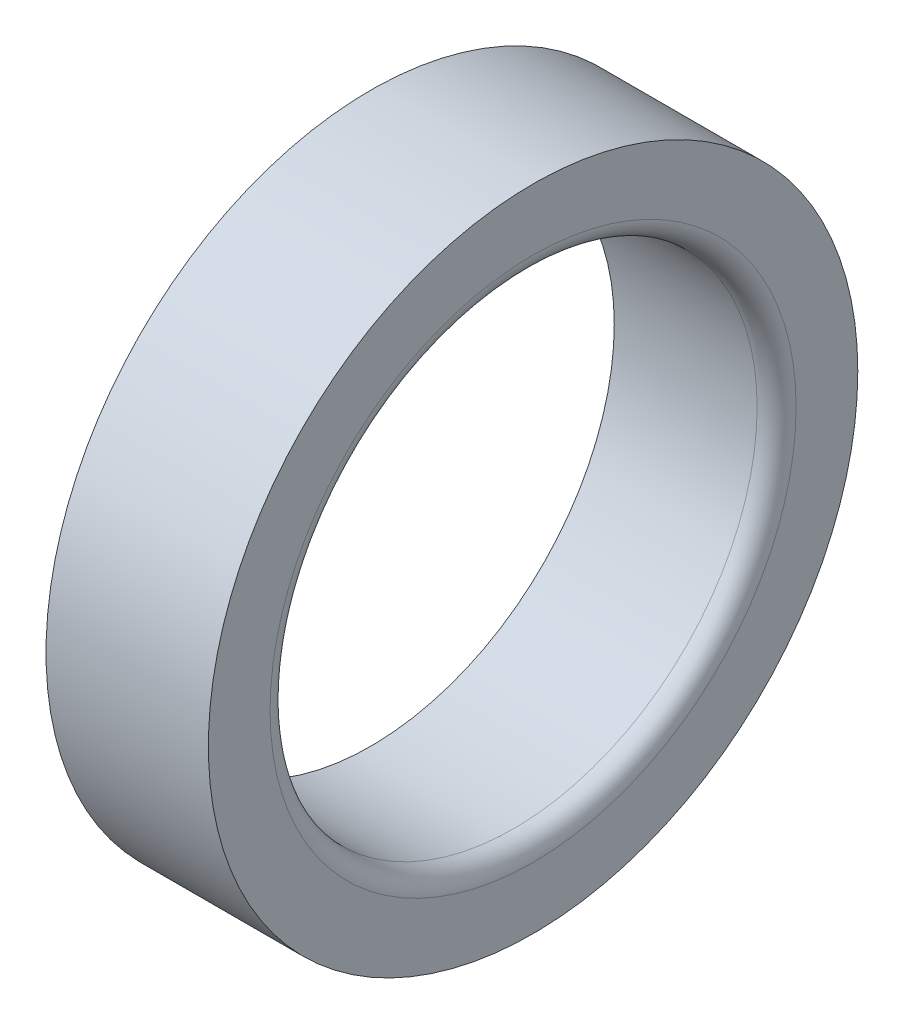
ISO-10303-21;
HEADER;
FILE_DESCRIPTION(('STEP AP214'),'2;1');
FILE_NAME('part.step','',(''),(''),'','','');
FILE_SCHEMA(('AUTOMOTIVE_DESIGN { 1 0 10303 214 1 1 1 1 }'));
ENDSEC;
DATA;
#1=APPLICATION_CONTEXT('core data for automotive mechanical design processes');
#2=APPLICATION_PROTOCOL_DEFINITION('international standard','automotive_design',2000,#1);
#3=PRODUCT_CONTEXT('',#1,'mechanical');
#4=PRODUCT('Part','Part','',(#3));
#5=PRODUCT_RELATED_PRODUCT_CATEGORY('part','',(#4));
#6=PRODUCT_DEFINITION_FORMATION('','',#4);
#7=PRODUCT_DEFINITION_CONTEXT('part definition',#1,'design');
#8=PRODUCT_DEFINITION('design','',#6,#7);
#9=PRODUCT_DEFINITION_SHAPE('','',#8);
#10=(LENGTH_UNIT() NAMED_UNIT(*) SI_UNIT(.MILLI.,.METRE.));
#11=(NAMED_UNIT(*) PLANE_ANGLE_UNIT() SI_UNIT($,.RADIAN.));
#12=(NAMED_UNIT(*) SI_UNIT($,.STERADIAN.) SOLID_ANGLE_UNIT());
#13=UNCERTAINTY_MEASURE_WITH_UNIT(LENGTH_MEASURE(1.E-05),#10,'distance_accuracy_value','');
#14=(GEOMETRIC_REPRESENTATION_CONTEXT(3) GLOBAL_UNCERTAINTY_ASSIGNED_CONTEXT((#13)) GLOBAL_UNIT_ASSIGNED_CONTEXT((#10,
#11,#12)) REPRESENTATION_CONTEXT('',''));
#15=CARTESIAN_POINT('',(0.,0.,0.));
#16=DIRECTION('',(0.,0.,1.));
#17=DIRECTION('',(1.,0.,0.));
#18=AXIS2_PLACEMENT_3D('',#15,#16,#17);
#19=CARTESIAN_POINT('',(6.34999999999997,0.,0.));
#20=DIRECTION('',(-1.,0.,0.));
#21=DIRECTION('',(0.,0.,1.));
#22=AXIS2_PLACEMENT_3D('',#19,#20,#21);
#23=CYLINDRICAL_SURFACE('',#22,12.7);
#24=CARTESIAN_POINT('',(6.34999999999997,0.,0.));
#25=DIRECTION('',(1.,0.,0.));
#26=DIRECTION('',(0.,0.,-1.));
#27=AXIS2_PLACEMENT_3D('',#24,#25,#26);
#28=CIRCLE('',#27,12.7);
#29=CARTESIAN_POINT('',(6.34999999999997,0.,-12.7));
#30=VERTEX_POINT('',#29);
#31=EDGE_CURVE('E89',#30,#30,#28,.T.);
#32=ORIENTED_EDGE('',*,*,#31,.F.);
#33=EDGE_LOOP('',(#32));
#34=FACE_BOUND('',#33,.T.);
#35=CARTESIAN_POINT('',(0.,0.,0.));
#36=DIRECTION('',(1.,0.,0.));
#37=DIRECTION('',(0.,0.,-1.));
#38=AXIS2_PLACEMENT_3D('',#35,#36,#37);
#39=CIRCLE('',#38,12.7);
#40=CARTESIAN_POINT('',(0.,0.,-12.7));
#41=VERTEX_POINT('',#40);
#42=EDGE_CURVE('E93',#41,#41,#39,.T.);
#43=ORIENTED_EDGE('',*,*,#42,.T.);
#44=EDGE_LOOP('',(#43));
#45=FACE_BOUND('',#44,.T.);
#46=ADVANCED_FACE('F78',(#34,#45),#23,.T.);
#47=CARTESIAN_POINT('',(6.34999999999997,0.,0.));
#48=DIRECTION('',(1.,0.,0.));
#49=DIRECTION('',(0.,0.,-1.));
#50=AXIS2_PLACEMENT_3D('',#47,#48,#49);
#51=PLANE('',#50);
#52=CARTESIAN_POINT('',(6.34999999999997,0.,0.));
#53=DIRECTION('',(1.,0.,0.));
#54=DIRECTION('',(0.,0.,-1.));
#55=AXIS2_PLACEMENT_3D('',#52,#53,#54);
#56=CIRCLE('',#55,10.287);
#57=CARTESIAN_POINT('',(6.34999999999997,0.,-10.287));
#58=VERTEX_POINT('',#57);
#59=EDGE_CURVE('E13',#58,#58,#56,.F.);
#60=ORIENTED_EDGE('',*,*,#59,.T.);
#61=EDGE_LOOP('',(#60));
#62=FACE_BOUND('',#61,.T.);
#63=ORIENTED_EDGE('',*,*,#31,.T.);
#64=EDGE_LOOP('',(#63));
#65=FACE_BOUND('',#64,.T.);
#66=ADVANCED_FACE('F107',(#62,#65),#51,.T.);
#67=CARTESIAN_POINT('',(0.,0.,0.));
#68=DIRECTION('',(1.,0.,0.));
#69=DIRECTION('',(0.,0.,-1.));
#70=AXIS2_PLACEMENT_3D('',#67,#68,#69);
#71=PLANE('',#70);
#72=CARTESIAN_POINT('',(0.,0.,0.));
#73=DIRECTION('',(1.,0.,0.));
#74=DIRECTION('',(0.,0.,-1.));
#75=AXIS2_PLACEMENT_3D('',#72,#73,#74);
#76=CIRCLE('',#75,9.525);
#77=CARTESIAN_POINT('',(0.,0.,-9.52500000000002));
#78=VERTEX_POINT('',#77);
#79=EDGE_CURVE('E97',#78,#78,#76,.F.);
#80=ORIENTED_EDGE('',*,*,#79,.F.);
#81=EDGE_LOOP('',(#80));
#82=FACE_BOUND('',#81,.T.);
#83=ORIENTED_EDGE('',*,*,#42,.F.);
#84=EDGE_LOOP('',(#83));
#85=FACE_BOUND('',#84,.T.);
#86=ADVANCED_FACE('F104',(#82,#85),#71,.F.);
#87=CARTESIAN_POINT('',(-0.00100000000002876,0.,0.));
#88=DIRECTION('',(1.,0.,0.));
#89=DIRECTION('',(0.,0.,-1.));
#90=AXIS2_PLACEMENT_3D('',#87,#88,#89);
#91=CYLINDRICAL_SURFACE('',#90,9.525);
#92=CARTESIAN_POINT('',(5.58800000000004,0.,0.));
#93=DIRECTION('',(1.,0.,0.));
#94=DIRECTION('',(0.,0.,-1.));
#95=AXIS2_PLACEMENT_3D('',#92,#93,#94);
#96=CIRCLE('',#95,9.525);
#97=CARTESIAN_POINT('',(5.58800000000004,0.,-9.52500000000002));
#98=VERTEX_POINT('',#97);
#99=EDGE_CURVE('E85',#98,#98,#96,.T.);
#100=ORIENTED_EDGE('',*,*,#99,.T.);
#101=EDGE_LOOP('',(#100));
#102=FACE_BOUND('',#101,.T.);
#103=ORIENTED_EDGE('',*,*,#79,.T.);
#104=EDGE_LOOP('',(#103));
#105=FACE_BOUND('',#104,.T.);
#106=ADVANCED_FACE('F102',(#102,#105),#91,.F.);
#107=CARTESIAN_POINT('',(5.58800000000004,0.,0.));
#108=DIRECTION('',(1.,0.,0.));
#109=DIRECTION('',(0.,0.,-1.));
#110=AXIS2_PLACEMENT_3D('',#107,#108,#109);
#111=TOROIDAL_SURFACE('',#110,10.287,0.762);
#112=ORIENTED_EDGE('',*,*,#59,.F.);
#113=EDGE_LOOP('',(#112));
#114=FACE_BOUND('',#113,.T.);
#115=ORIENTED_EDGE('',*,*,#99,.F.);
#116=EDGE_LOOP('',(#115));
#117=FACE_BOUND('',#116,.T.);
#118=ADVANCED_FACE('F80',(#114,#117),#111,.T.);
#119=CLOSED_SHELL('',(#46,#66,#86,#106,#118));
#120=MANIFOLD_SOLID_BREP('B2',#119);
#121=ADVANCED_BREP_SHAPE_REPRESENTATION('',(#18,#120),#14);
#122=SHAPE_DEFINITION_REPRESENTATION(#9,#121);
ENDSEC;
END-ISO-10303-21;
